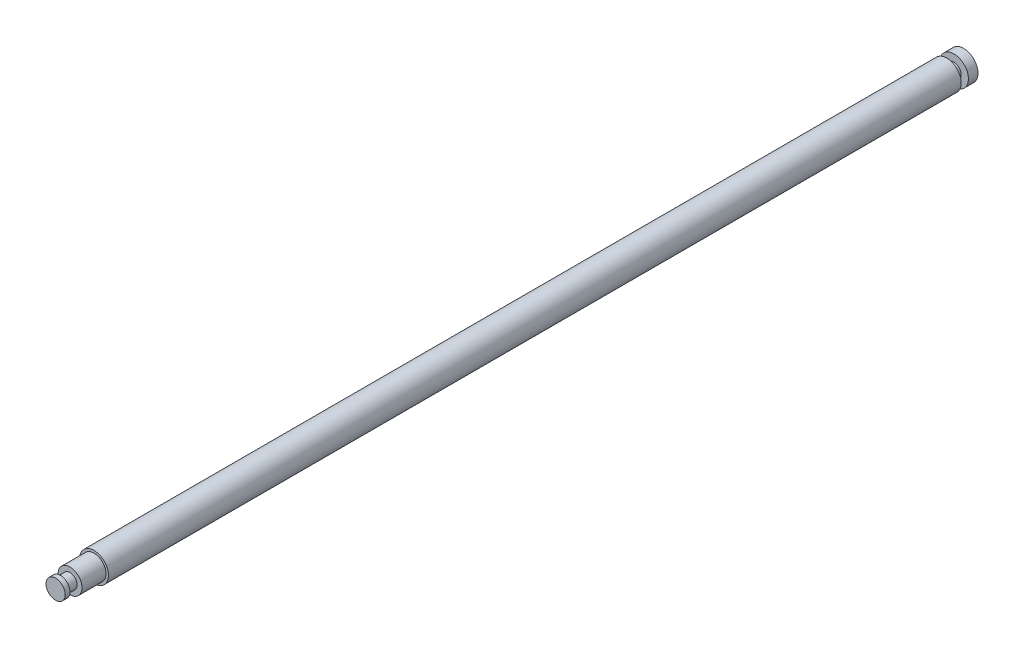
ISO-10303-21;
HEADER;
FILE_DESCRIPTION(('STEP AP214'),'2;1');
FILE_NAME('part.step','',(''),(''),'','','');
FILE_SCHEMA(('AUTOMOTIVE_DESIGN { 1 0 10303 214 1 1 1 1 }'));
ENDSEC;
DATA;
#1=APPLICATION_CONTEXT('core data for automotive mechanical design processes');
#2=APPLICATION_PROTOCOL_DEFINITION('international standard','automotive_design',2000,#1);
#3=PRODUCT_CONTEXT('',#1,'mechanical');
#4=PRODUCT('Part','Part','',(#3));
#5=PRODUCT_RELATED_PRODUCT_CATEGORY('part','',(#4));
#6=PRODUCT_DEFINITION_FORMATION('','',#4);
#7=PRODUCT_DEFINITION_CONTEXT('part definition',#1,'design');
#8=PRODUCT_DEFINITION('design','',#6,#7);
#9=PRODUCT_DEFINITION_SHAPE('','',#8);
#10=(LENGTH_UNIT() NAMED_UNIT(*) SI_UNIT(.MILLI.,.METRE.));
#11=(NAMED_UNIT(*) PLANE_ANGLE_UNIT() SI_UNIT($,.RADIAN.));
#12=(NAMED_UNIT(*) SI_UNIT($,.STERADIAN.) SOLID_ANGLE_UNIT());
#13=UNCERTAINTY_MEASURE_WITH_UNIT(LENGTH_MEASURE(1.E-05),#10,'distance_accuracy_value','');
#14=(GEOMETRIC_REPRESENTATION_CONTEXT(3) GLOBAL_UNCERTAINTY_ASSIGNED_CONTEXT((#13)) GLOBAL_UNIT_ASSIGNED_CONTEXT((#10,
#11,#12)) REPRESENTATION_CONTEXT('',''));
#15=CARTESIAN_POINT('',(0.,0.,0.));
#16=DIRECTION('',(0.,0.,1.));
#17=DIRECTION('',(1.,0.,0.));
#18=AXIS2_PLACEMENT_3D('',#15,#16,#17);
#19=CARTESIAN_POINT('',(0.,0.,94.5));
#20=DIRECTION('',(0.,0.,-1.));
#21=DIRECTION('',(-1.,0.,0.));
#22=AXIS2_PLACEMENT_3D('',#19,#20,#21);
#23=PLANE('',#22);
#24=CARTESIAN_POINT('',(0.,0.,94.5));
#25=DIRECTION('',(0.,0.,1.));
#26=DIRECTION('',(1.,0.,0.));
#27=AXIS2_PLACEMENT_3D('',#24,#25,#26);
#28=CIRCLE('',#27,2.00000000000001);
#29=CARTESIAN_POINT('',(2.00000000000001,0.,94.5));
#30=VERTEX_POINT('',#29);
#31=EDGE_CURVE('E10',#30,#30,#28,.T.);
#32=ORIENTED_EDGE('',*,*,#31,.T.);
#33=EDGE_LOOP('',(#32));
#34=FACE_BOUND('',#33,.T.);
#35=ADVANCED_FACE('F30',(#34),#23,.F.);
#36=CARTESIAN_POINT('',(0.,0.,94.5));
#37=DIRECTION('',(0.,0.,1.));
#38=DIRECTION('',(1.,0.,0.));
#39=AXIS2_PLACEMENT_3D('',#36,#37,#38);
#40=CYLINDRICAL_SURFACE('',#39,2.00000000000001);
#41=ORIENTED_EDGE('',*,*,#31,.F.);
#42=EDGE_LOOP('',(#41));
#43=FACE_BOUND('',#42,.T.);
#44=CARTESIAN_POINT('',(0.,0.,93.5));
#45=DIRECTION('',(0.,0.,1.));
#46=DIRECTION('',(1.,0.,0.));
#47=AXIS2_PLACEMENT_3D('',#44,#45,#46);
#48=CIRCLE('',#47,2.00000000000001);
#49=CARTESIAN_POINT('',(2.00000000000001,0.,93.5));
#50=VERTEX_POINT('',#49);
#51=EDGE_CURVE('E36',#50,#50,#48,.T.);
#52=ORIENTED_EDGE('',*,*,#51,.T.);
#53=EDGE_LOOP('',(#52));
#54=FACE_BOUND('',#53,.T.);
#55=ADVANCED_FACE('F86',(#43,#54),#40,.T.);
#56=CARTESIAN_POINT('',(0.,2.,93.5));
#57=DIRECTION('',(0.,0.,1.));
#58=DIRECTION('',(1.,0.,0.));
#59=AXIS2_PLACEMENT_3D('',#56,#57,#58);
#60=PLANE('',#59);
#61=ORIENTED_EDGE('',*,*,#51,.F.);
#62=EDGE_LOOP('',(#61));
#63=FACE_BOUND('',#62,.T.);
#64=CARTESIAN_POINT('',(0.,0.,93.5));
#65=DIRECTION('',(0.,0.,1.));
#66=DIRECTION('',(1.,0.,0.));
#67=AXIS2_PLACEMENT_3D('',#64,#65,#66);
#68=CIRCLE('',#67,1.50000000000001);
#69=CARTESIAN_POINT('',(1.50000000000001,0.,93.5));
#70=VERTEX_POINT('',#69);
#71=EDGE_CURVE('E40',#70,#70,#68,.T.);
#72=ORIENTED_EDGE('',*,*,#71,.T.);
#73=EDGE_LOOP('',(#72));
#74=FACE_BOUND('',#73,.T.);
#75=ADVANCED_FACE('F90',(#63,#74),#60,.F.);
#76=CARTESIAN_POINT('',(0.,0.,94.5));
#77=DIRECTION('',(0.,0.,1.));
#78=DIRECTION('',(1.,0.,0.));
#79=AXIS2_PLACEMENT_3D('',#76,#77,#78);
#80=CYLINDRICAL_SURFACE('',#79,1.50000000000001);
#81=ORIENTED_EDGE('',*,*,#71,.F.);
#82=EDGE_LOOP('',(#81));
#83=FACE_BOUND('',#82,.T.);
#84=CARTESIAN_POINT('',(0.,0.,91.5));
#85=DIRECTION('',(0.,0.,1.));
#86=DIRECTION('',(1.,0.,0.));
#87=AXIS2_PLACEMENT_3D('',#84,#85,#86);
#88=CIRCLE('',#87,1.50000000000001);
#89=CARTESIAN_POINT('',(1.50000000000001,0.,91.5));
#90=VERTEX_POINT('',#89);
#91=EDGE_CURVE('E44',#90,#90,#88,.T.);
#92=ORIENTED_EDGE('',*,*,#91,.T.);
#93=EDGE_LOOP('',(#92));
#94=FACE_BOUND('',#93,.T.);
#95=ADVANCED_FACE('F95',(#83,#94),#80,.T.);
#96=CARTESIAN_POINT('',(0.,1.5,91.5));
#97=DIRECTION('',(0.,0.,-1.));
#98=DIRECTION('',(-1.,0.,0.));
#99=AXIS2_PLACEMENT_3D('',#96,#97,#98);
#100=PLANE('',#99);
#101=ORIENTED_EDGE('',*,*,#91,.F.);
#102=EDGE_LOOP('',(#101));
#103=FACE_BOUND('',#102,.T.);
#104=CARTESIAN_POINT('',(0.,0.,91.5));
#105=DIRECTION('',(0.,0.,1.));
#106=DIRECTION('',(1.,0.,0.));
#107=AXIS2_PLACEMENT_3D('',#104,#105,#106);
#108=CIRCLE('',#107,2.50000000000001);
#109=CARTESIAN_POINT('',(2.50000000000001,0.,91.5));
#110=VERTEX_POINT('',#109);
#111=EDGE_CURVE('E49',#110,#110,#108,.T.);
#112=ORIENTED_EDGE('',*,*,#111,.T.);
#113=EDGE_LOOP('',(#112));
#114=FACE_BOUND('',#113,.T.);
#115=ADVANCED_FACE('F101',(#103,#114),#100,.F.);
#116=CARTESIAN_POINT('',(0.,0.,94.5));
#117=DIRECTION('',(0.,0.,1.));
#118=DIRECTION('',(1.,0.,0.));
#119=AXIS2_PLACEMENT_3D('',#116,#117,#118);
#120=CYLINDRICAL_SURFACE('',#119,2.50000000000001);
#121=ORIENTED_EDGE('',*,*,#111,.F.);
#122=EDGE_LOOP('',(#121));
#123=FACE_BOUND('',#122,.T.);
#124=CARTESIAN_POINT('',(0.,0.,86.5));
#125=DIRECTION('',(0.,0.,1.));
#126=DIRECTION('',(1.,0.,0.));
#127=AXIS2_PLACEMENT_3D('',#124,#125,#126);
#128=CIRCLE('',#127,2.50000000000001);
#129=CARTESIAN_POINT('',(2.50000000000001,0.,86.5));
#130=VERTEX_POINT('',#129);
#131=EDGE_CURVE('E52',#130,#130,#128,.T.);
#132=ORIENTED_EDGE('',*,*,#131,.T.);
#133=EDGE_LOOP('',(#132));
#134=FACE_BOUND('',#133,.T.);
#135=ADVANCED_FACE('F105',(#123,#134),#120,.T.);
#136=CARTESIAN_POINT('',(0.,2.5,86.5));
#137=DIRECTION('',(0.,0.,-1.));
#138=DIRECTION('',(-1.,0.,0.));
#139=AXIS2_PLACEMENT_3D('',#136,#137,#138);
#140=PLANE('',#139);
#141=ORIENTED_EDGE('',*,*,#131,.F.);
#142=EDGE_LOOP('',(#141));
#143=FACE_BOUND('',#142,.T.);
#144=CARTESIAN_POINT('',(0.,0.,86.5));
#145=DIRECTION('',(0.,0.,1.));
#146=DIRECTION('',(1.,0.,0.));
#147=AXIS2_PLACEMENT_3D('',#144,#145,#146);
#148=CIRCLE('',#147,3.00000000000001);
#149=CARTESIAN_POINT('',(3.00000000000001,0.,86.5));
#150=VERTEX_POINT('',#149);
#151=EDGE_CURVE('E55',#150,#150,#148,.T.);
#152=ORIENTED_EDGE('',*,*,#151,.T.);
#153=EDGE_LOOP('',(#152));
#154=FACE_BOUND('',#153,.T.);
#155=ADVANCED_FACE('F109',(#143,#154),#140,.F.);
#156=CARTESIAN_POINT('',(0.,0.,94.5));
#157=DIRECTION('',(0.,0.,1.));
#158=DIRECTION('',(1.,0.,0.));
#159=AXIS2_PLACEMENT_3D('',#156,#157,#158);
#160=CYLINDRICAL_SURFACE('',#159,3.00000000000001);
#161=ORIENTED_EDGE('',*,*,#151,.F.);
#162=EDGE_LOOP('',(#161));
#163=FACE_BOUND('',#162,.T.);
#164=CARTESIAN_POINT('',(0.,0.,-91.));
#165=DIRECTION('',(0.,0.,1.));
#166=DIRECTION('',(1.,0.,0.));
#167=AXIS2_PLACEMENT_3D('',#164,#165,#166);
#168=CIRCLE('',#167,3.00000000000001);
#169=CARTESIAN_POINT('',(3.00000000000001,0.,-91.));
#170=VERTEX_POINT('',#169);
#171=EDGE_CURVE('E58',#170,#170,#168,.T.);
#172=ORIENTED_EDGE('',*,*,#171,.T.);
#173=EDGE_LOOP('',(#172));
#174=FACE_BOUND('',#173,.T.);
#175=ADVANCED_FACE('F113',(#163,#174),#160,.T.);
#176=CARTESIAN_POINT('',(0.,3.,-91.));
#177=DIRECTION('',(0.,0.,1.));
#178=DIRECTION('',(1.,0.,0.));
#179=AXIS2_PLACEMENT_3D('',#176,#177,#178);
#180=PLANE('',#179);
#181=ORIENTED_EDGE('',*,*,#171,.F.);
#182=EDGE_LOOP('',(#181));
#183=FACE_BOUND('',#182,.T.);
#184=CARTESIAN_POINT('',(0.,0.,-91.));
#185=DIRECTION('',(0.,0.,1.));
#186=DIRECTION('',(1.,0.,0.));
#187=AXIS2_PLACEMENT_3D('',#184,#185,#186);
#188=CIRCLE('',#187,1.50000000000001);
#189=CARTESIAN_POINT('',(1.50000000000001,0.,-91.));
#190=VERTEX_POINT('',#189);
#191=EDGE_CURVE('E61',#190,#190,#188,.T.);
#192=ORIENTED_EDGE('',*,*,#191,.T.);
#193=EDGE_LOOP('',(#192));
#194=FACE_BOUND('',#193,.T.);
#195=ADVANCED_FACE('F117',(#183,#194),#180,.F.);
#196=CARTESIAN_POINT('',(0.,0.,94.5));
#197=DIRECTION('',(0.,0.,1.));
#198=DIRECTION('',(1.,0.,0.));
#199=AXIS2_PLACEMENT_3D('',#196,#197,#198);
#200=CYLINDRICAL_SURFACE('',#199,1.50000000000001);
#201=ORIENTED_EDGE('',*,*,#191,.F.);
#202=EDGE_LOOP('',(#201));
#203=FACE_BOUND('',#202,.T.);
#204=CARTESIAN_POINT('',(0.,0.,-92.5));
#205=DIRECTION('',(0.,0.,1.));
#206=DIRECTION('',(1.,0.,0.));
#207=AXIS2_PLACEMENT_3D('',#204,#205,#206);
#208=CIRCLE('',#207,1.50000000000001);
#209=CARTESIAN_POINT('',(1.50000000000001,0.,-92.5));
#210=VERTEX_POINT('',#209);
#211=EDGE_CURVE('E64',#210,#210,#208,.T.);
#212=ORIENTED_EDGE('',*,*,#211,.T.);
#213=EDGE_LOOP('',(#212));
#214=FACE_BOUND('',#213,.T.);
#215=ADVANCED_FACE('F121',(#203,#214),#200,.T.);
#216=CARTESIAN_POINT('',(0.,1.5,-92.5));
#217=DIRECTION('',(0.,0.,-1.));
#218=DIRECTION('',(-1.,0.,0.));
#219=AXIS2_PLACEMENT_3D('',#216,#217,#218);
#220=PLANE('',#219);
#221=ORIENTED_EDGE('',*,*,#211,.F.);
#222=EDGE_LOOP('',(#221));
#223=FACE_BOUND('',#222,.T.);
#224=CARTESIAN_POINT('',(0.,0.,-92.5));
#225=DIRECTION('',(0.,0.,1.));
#226=DIRECTION('',(1.,0.,0.));
#227=AXIS2_PLACEMENT_3D('',#224,#225,#226);
#228=CIRCLE('',#227,3.00000000000001);
#229=CARTESIAN_POINT('',(3.00000000000001,0.,-92.5));
#230=VERTEX_POINT('',#229);
#231=EDGE_CURVE('E67',#230,#230,#228,.T.);
#232=ORIENTED_EDGE('',*,*,#231,.T.);
#233=EDGE_LOOP('',(#232));
#234=FACE_BOUND('',#233,.T.);
#235=ADVANCED_FACE('F82',(#223,#234),#220,.F.);
#236=CARTESIAN_POINT('',(0.,0.,94.5));
#237=DIRECTION('',(0.,0.,1.));
#238=DIRECTION('',(1.,0.,0.));
#239=AXIS2_PLACEMENT_3D('',#236,#237,#238);
#240=CYLINDRICAL_SURFACE('',#239,3.00000000000001);
#241=ORIENTED_EDGE('',*,*,#231,.F.);
#242=EDGE_LOOP('',(#241));
#243=FACE_BOUND('',#242,.T.);
#244=CARTESIAN_POINT('',(0.,0.,-94.5));
#245=DIRECTION('',(0.,0.,1.));
#246=DIRECTION('',(1.,0.,0.));
#247=AXIS2_PLACEMENT_3D('',#244,#245,#246);
#248=CIRCLE('',#247,3.00000000000001);
#249=CARTESIAN_POINT('',(3.00000000000001,0.,-94.5));
#250=VERTEX_POINT('',#249);
#251=EDGE_CURVE('E70',#250,#250,#248,.T.);
#252=ORIENTED_EDGE('',*,*,#251,.T.);
#253=EDGE_LOOP('',(#252));
#254=FACE_BOUND('',#253,.T.);
#255=ADVANCED_FACE('F74',(#243,#254),#240,.T.);
#256=CARTESIAN_POINT('',(0.,3.,-94.5));
#257=DIRECTION('',(0.,0.,1.));
#258=DIRECTION('',(1.,0.,0.));
#259=AXIS2_PLACEMENT_3D('',#256,#257,#258);
#260=PLANE('',#259);
#261=ORIENTED_EDGE('',*,*,#251,.F.);
#262=EDGE_LOOP('',(#261));
#263=FACE_BOUND('',#262,.T.);
#264=ADVANCED_FACE('F76',(#263),#260,.F.);
#265=CLOSED_SHELL('',(#35,#55,#75,#95,#115,#135,#155,#175,#195,#215,#235,#255,#264));
#266=MANIFOLD_SOLID_BREP('B2',#265);
#267=ADVANCED_BREP_SHAPE_REPRESENTATION('',(#18,#266),#14);
#268=SHAPE_DEFINITION_REPRESENTATION(#9,#267);
ENDSEC;
END-ISO-10303-21;
